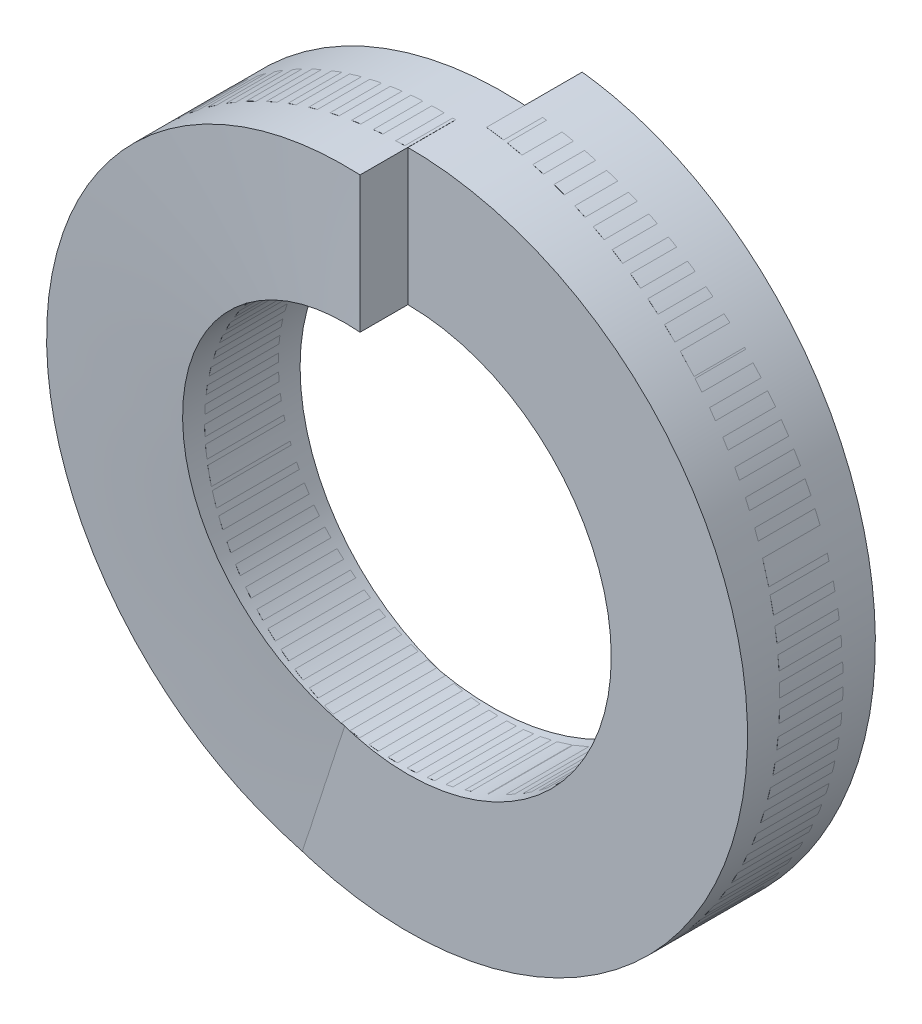
ISO-10303-21;
HEADER;
FILE_DESCRIPTION(('STEP AP214'),'2;1');
FILE_NAME('part.step','',(''),(''),'','','');
FILE_SCHEMA(('AUTOMOTIVE_DESIGN { 1 0 10303 214 1 1 1 1 }'));
ENDSEC;
DATA;
#1=APPLICATION_CONTEXT('core data for automotive mechanical design processes');
#2=APPLICATION_PROTOCOL_DEFINITION('international standard','automotive_design',2000,#1);
#3=PRODUCT_CONTEXT('',#1,'mechanical');
#4=PRODUCT('Part','Part','',(#3));
#5=PRODUCT_RELATED_PRODUCT_CATEGORY('part','',(#4));
#6=PRODUCT_DEFINITION_FORMATION('','',#4);
#7=PRODUCT_DEFINITION_CONTEXT('part definition',#1,'design');
#8=PRODUCT_DEFINITION('design','',#6,#7);
#9=PRODUCT_DEFINITION_SHAPE('','',#8);
#10=(LENGTH_UNIT() NAMED_UNIT(*) SI_UNIT(.MILLI.,.METRE.));
#11=(NAMED_UNIT(*) PLANE_ANGLE_UNIT() SI_UNIT($,.RADIAN.));
#12=(NAMED_UNIT(*) SI_UNIT($,.STERADIAN.) SOLID_ANGLE_UNIT());
#13=UNCERTAINTY_MEASURE_WITH_UNIT(LENGTH_MEASURE(1.E-05),#10,'distance_accuracy_value','');
#14=(GEOMETRIC_REPRESENTATION_CONTEXT(3) GLOBAL_UNCERTAINTY_ASSIGNED_CONTEXT((#13)) GLOBAL_UNIT_ASSIGNED_CONTEXT((#10,
#11,#12)) REPRESENTATION_CONTEXT('',''));
#15=CARTESIAN_POINT('',(0.,0.,0.));
#16=DIRECTION('',(0.,0.,1.));
#17=DIRECTION('',(1.,0.,0.));
#18=AXIS2_PLACEMENT_3D('',#15,#16,#17);
#19=CARTESIAN_POINT('',(0.,4.2418,1.1938));
#20=CARTESIAN_POINT('',(-1.75701108887419,4.2418,1.11089722222222));
#21=CARTESIAN_POINT('',(-2.9994055444371,2.9994055444371,1.02799444444444));
#22=CARTESIAN_POINT('',(-4.2418,1.75701108887419,0.945091666666666));
#23=CARTESIAN_POINT('',(-4.2418,0.,0.862188888888889));
#24=CARTESIAN_POINT('',(-4.2418,-1.75701108887419,0.779286111111111));
#25=CARTESIAN_POINT('',(-2.9994055444371,-2.9994055444371,0.696383333333333));
#26=CARTESIAN_POINT('',(-1.7570110888742,-4.2418,0.613480555555555));
#27=CARTESIAN_POINT('',(0.,-4.2418,0.530577777777778));
#28=CARTESIAN_POINT('',(1.75701108887419,-4.2418,0.447675));
#29=CARTESIAN_POINT('',(2.9994055444371,-2.9994055444371,0.364772222222222));
#30=CARTESIAN_POINT('',(4.2418,-1.7570110888742,0.281869444444444));
#31=CARTESIAN_POINT('',(4.2418,0.,0.198966666666666));
#32=CARTESIAN_POINT('',(4.2418,1.7570110888742,0.116063888888889));
#33=CARTESIAN_POINT('',(2.9994055444371,2.9994055444371,0.0331611111111108));
#34=CARTESIAN_POINT('',(1.86603502883287,4.13277606004133,-0.0424666925822432));
#35=CARTESIAN_POINT('',(0.266370499691194,4.23342816130075,-0.119912402591284));
#36=CARTESIAN_POINT('',(0.,2.54,1.1938));
#37=CARTESIAN_POINT('',(-1.05210244842766,2.54,1.11089722222222));
#38=CARTESIAN_POINT('',(-1.79605122421383,1.79605122421383,1.02799444444444));
#39=CARTESIAN_POINT('',(-2.54,1.05210244842766,0.945091666666667));
#40=CARTESIAN_POINT('',(-2.54,0.,0.862188888888889));
#41=CARTESIAN_POINT('',(-2.54,-1.05210244842766,0.779286111111111));
#42=CARTESIAN_POINT('',(-1.79605122421383,-1.79605122421383,0.696383333333333));
#43=CARTESIAN_POINT('',(-1.05210244842766,-2.54,0.613480555555556));
#44=CARTESIAN_POINT('',(0.,-2.54,0.530577777777778));
#45=CARTESIAN_POINT('',(1.05210244842766,-2.54,0.447675));
#46=CARTESIAN_POINT('',(1.79605122421383,-1.79605122421383,0.364772222222222));
#47=CARTESIAN_POINT('',(2.54,-1.05210244842766,0.281869444444445));
#48=CARTESIAN_POINT('',(2.54,0.,0.198966666666667));
#49=CARTESIAN_POINT('',(2.54,1.05210244842766,0.116063888888889));
#50=CARTESIAN_POINT('',(1.79605122421383,1.79605122421383,0.0331611111111111));
#51=CARTESIAN_POINT('',(1.1173862448101,2.47471620361756,-0.042466692582243));
#52=CARTESIAN_POINT('',(0.15950329322826,2.53498692293458,-0.119912402591283));
#53=(BOUNDED_SURFACE() B_SPLINE_SURFACE(1,2,((#19,#20,#21,#22,#23,#24,#25,#26,#27,#28,#29,#30,
#31,#32,#33,#34,#35),(#36,#37,#38,#39,#40,#41,#42,#43,#44,#45,#46,#47,#48,#49,#50,#51,#52)),
.UNSPECIFIED.,.F.,.F.,.F.) B_SPLINE_SURFACE_WITH_KNOTS((2,2),(3,2,2,2,2,2,2,2,3),(0.,1.),(0.,
0.125,0.25,0.375,0.5,0.625,0.75,0.875,0.989797691254952),
.UNSPECIFIED.) GEOMETRIC_REPRESENTATION_ITEM() RATIONAL_B_SPLINE_SURFACE(((1.,0.923879532511287,
1.,0.923879532511287,1.,0.923879532511287,1.,0.923879532511287,1.,0.923879532511287,1.,
0.923879532511287,1.,0.923879532511287,1.,0.930092368600385,0.988588492173218),(1.,
0.923879532511287,1.,0.923879532511287,1.,0.923879532511287,1.,0.923879532511287,1.,
0.923879532511287,1.,0.923879532511287,1.,0.923879532511287,1.,0.930092368600385,0.988588492173218))) REPRESENTATION_ITEM('') SURFACE());
#54=CARTESIAN_POINT('',(0.,4.2418,1.1938));
#55=CARTESIAN_POINT('',(-1.75701108887419,4.2418,1.11089722222222));
#56=CARTESIAN_POINT('',(-2.9994055444371,2.9994055444371,1.02799444444444));
#57=CARTESIAN_POINT('',(-4.2418,1.75701108887419,0.945091666666666));
#58=CARTESIAN_POINT('',(-4.2418,0.,0.862188888888889));
#59=CARTESIAN_POINT('',(-4.2418,-1.75701108887419,0.779286111111111));
#60=CARTESIAN_POINT('',(-2.9994055444371,-2.9994055444371,0.696383333333333));
#61=CARTESIAN_POINT('',(-1.7570110888742,-4.2418,0.613480555555555));
#62=CARTESIAN_POINT('',(0.,-4.2418,0.530577777777778));
#63=CARTESIAN_POINT('',(1.75701108887419,-4.2418,0.447675));
#64=CARTESIAN_POINT('',(2.9994055444371,-2.9994055444371,0.364772222222222));
#65=CARTESIAN_POINT('',(4.2418,-1.7570110888742,0.281869444444444));
#66=CARTESIAN_POINT('',(4.2418,0.,0.198966666666666));
#67=CARTESIAN_POINT('',(4.2418,1.7570110888742,0.116063888888889));
#68=CARTESIAN_POINT('',(2.9994055444371,2.9994055444371,0.0331611111111108));
#69=CARTESIAN_POINT('',(1.86603502883287,4.13277606004133,-0.0424666925822432));
#70=CARTESIAN_POINT('',(0.266370499691194,4.23342816130075,-0.119912402591284));
#71=(BOUNDED_CURVE() B_SPLINE_CURVE(2,(#54,#55,#56,#57,#58,#59,#60,#61,#62,#63,#64,#65,#66,#67,
#68,#69,#70),.UNSPECIFIED.,.F.,.F.) B_SPLINE_CURVE_WITH_KNOTS((3,2,2,2,2,2,2,2,3),(0.,0.125,
0.25,0.375,0.5,0.625,0.75,0.875,0.989797691254952),
.UNSPECIFIED.) CURVE() GEOMETRIC_REPRESENTATION_ITEM() RATIONAL_B_SPLINE_CURVE((1.,
0.923879532511287,1.,0.923879532511287,1.,0.923879532511287,1.,0.923879532511287,1.,
0.923879532511287,1.,0.923879532511287,1.,0.923879532511287,1.,0.930092368600385,0.988588492173218)) REPRESENTATION_ITEM(''));
#72=CARTESIAN_POINT('',(0.,4.2418,1.1938));
#73=VERTEX_POINT('',#72);
#74=CARTESIAN_POINT('',(0.266370499687325,4.23342816123927,-0.119912402577863));
#75=VERTEX_POINT('',#74);
#76=EDGE_CURVE('P0_E22',#73,#75,#71,.T.);
#77=DIRECTION('',(0.0627965721371101,0.99802634761204,0.));
#78=VECTOR('',#77,1.);
#79=CARTESIAN_POINT('',(0.186220094843992,2.95959723252612,-0.119912402564443));
#80=LINE('',#79,#78);
#81=CARTESIAN_POINT('',(0.159503293230576,2.5349869229714,-0.119912402577863));
#82=VERTEX_POINT('',#81);
#83=EDGE_CURVE('P0_E98',#75,#82,#80,.F.);
#84=CARTESIAN_POINT('',(0.,2.54,1.1938));
#85=CARTESIAN_POINT('',(-1.05210244842766,2.54,1.11089722222222));
#86=CARTESIAN_POINT('',(-1.79605122421383,1.79605122421383,1.02799444444444));
#87=CARTESIAN_POINT('',(-2.54,1.05210244842766,0.945091666666667));
#88=CARTESIAN_POINT('',(-2.54,0.,0.862188888888889));
#89=CARTESIAN_POINT('',(-2.54,-1.05210244842766,0.779286111111111));
#90=CARTESIAN_POINT('',(-1.79605122421383,-1.79605122421383,0.696383333333333));
#91=CARTESIAN_POINT('',(-1.05210244842766,-2.54,0.613480555555556));
#92=CARTESIAN_POINT('',(0.,-2.54,0.530577777777778));
#93=CARTESIAN_POINT('',(1.05210244842766,-2.54,0.447675));
#94=CARTESIAN_POINT('',(1.79605122421383,-1.79605122421383,0.364772222222222));
#95=CARTESIAN_POINT('',(2.54,-1.05210244842766,0.281869444444445));
#96=CARTESIAN_POINT('',(2.54,0.,0.198966666666667));
#97=CARTESIAN_POINT('',(2.54,1.05210244842766,0.116063888888889));
#98=CARTESIAN_POINT('',(1.79605122421383,1.79605122421383,0.0331611111111111));
#99=CARTESIAN_POINT('',(1.1173862448101,2.47471620361756,-0.042466692582243));
#100=CARTESIAN_POINT('',(0.15950329322826,2.53498692293458,-0.119912402591283));
#101=(BOUNDED_CURVE() B_SPLINE_CURVE(2,(#84,#85,#86,#87,#88,#89,#90,#91,#92,#93,#94,#95,#96,#97,
#98,#99,#100),.UNSPECIFIED.,.F.,.F.) B_SPLINE_CURVE_WITH_KNOTS((3,2,2,2,2,2,2,2,3),(0.,0.125,
0.25,0.375,0.5,0.625,0.75,0.875,0.989797691254952),
.UNSPECIFIED.) CURVE() GEOMETRIC_REPRESENTATION_ITEM() RATIONAL_B_SPLINE_CURVE((1.,
0.923879532511287,1.,0.923879532511287,1.,0.923879532511287,1.,0.923879532511287,1.,
0.923879532511287,1.,0.923879532511287,1.,0.923879532511287,1.,0.930092368600385,0.988588492173218)) REPRESENTATION_ITEM(''));
#102=CARTESIAN_POINT('',(0.,2.54,1.1938));
#103=VERTEX_POINT('',#102);
#104=EDGE_CURVE('P0_E62',#82,#103,#101,.F.);
#105=DIRECTION('',(0.,-1.,0.));
#106=VECTOR('',#105,1.);
#107=CARTESIAN_POINT('',(0.,3.3909,1.1938));
#108=LINE('',#107,#106);
#109=EDGE_CURVE('P0_E58',#73,#103,#108,.T.);
#110=ORIENTED_EDGE('',*,*,#76,.T.);
#111=ORIENTED_EDGE('',*,*,#83,.T.);
#112=ORIENTED_EDGE('',*,*,#104,.T.);
#113=ORIENTED_EDGE('',*,*,#109,.F.);
#114=EDGE_LOOP('',(#110,#111,#112,#113));
#115=FACE_BOUND('',#114,.T.);
#116=ADVANCED_FACE('P0_F17',(#115),#53,.F.);
#117=CARTESIAN_POINT('',(0.,4.2418,0.));
#118=CARTESIAN_POINT('',(-1.75701108887419,4.2418,-0.0829027777777778));
#119=CARTESIAN_POINT('',(-2.9994055444371,2.9994055444371,-0.165805555555556));
#120=CARTESIAN_POINT('',(-4.2418,1.75701108887419,-0.248708333333333));
#121=CARTESIAN_POINT('',(-4.2418,0.,-0.331611111111111));
#122=CARTESIAN_POINT('',(-4.2418,-1.75701108887419,-0.414513888888889));
#123=CARTESIAN_POINT('',(-2.9994055444371,-2.9994055444371,-0.497416666666667));
#124=CARTESIAN_POINT('',(-1.7570110888742,-4.2418,-0.580319444444445));
#125=CARTESIAN_POINT('',(0.,-4.2418,-0.663222222222222));
#126=CARTESIAN_POINT('',(1.75701108887419,-4.2418,-0.746125));
#127=CARTESIAN_POINT('',(2.9994055444371,-2.9994055444371,-0.829027777777778));
#128=CARTESIAN_POINT('',(4.2418,-1.7570110888742,-0.911930555555556));
#129=CARTESIAN_POINT('',(4.2418,0.,-0.994833333333333));
#130=CARTESIAN_POINT('',(4.2418,1.7570110888742,-1.07773611111111));
#131=CARTESIAN_POINT('',(2.9994055444371,2.9994055444371,-1.16063888888889));
#132=CARTESIAN_POINT('',(1.86603502905745,4.13277605981674,-1.23626669256726));
#133=CARTESIAN_POINT('',(0.266370500245948,4.23342816126585,-1.31371240256443));
#134=CARTESIAN_POINT('',(0.,4.2418,1.1938));
#135=CARTESIAN_POINT('',(-1.75701108887419,4.2418,1.11089722222222));
#136=CARTESIAN_POINT('',(-2.9994055444371,2.9994055444371,1.02799444444444));
#137=CARTESIAN_POINT('',(-4.2418,1.75701108887419,0.945091666666666));
#138=CARTESIAN_POINT('',(-4.2418,0.,0.862188888888889));
#139=CARTESIAN_POINT('',(-4.2418,-1.75701108887419,0.779286111111111));
#140=CARTESIAN_POINT('',(-2.9994055444371,-2.9994055444371,0.696383333333333));
#141=CARTESIAN_POINT('',(-1.7570110888742,-4.2418,0.613480555555555));
#142=CARTESIAN_POINT('',(0.,-4.2418,0.530577777777778));
#143=CARTESIAN_POINT('',(1.75701108887419,-4.2418,0.447675));
#144=CARTESIAN_POINT('',(2.9994055444371,-2.9994055444371,0.364772222222222));
#145=CARTESIAN_POINT('',(4.2418,-1.7570110888742,0.281869444444444));
#146=CARTESIAN_POINT('',(4.2418,0.,0.198966666666666));
#147=CARTESIAN_POINT('',(4.2418,1.7570110888742,0.116063888888889));
#148=CARTESIAN_POINT('',(2.9994055444371,2.9994055444371,0.0331611111111108));
#149=CARTESIAN_POINT('',(1.86603502905745,4.13277605981674,-0.0424666925672572));
#150=CARTESIAN_POINT('',(0.266370500245948,4.23342816126585,-0.119912402564426));
#151=(BOUNDED_SURFACE() B_SPLINE_SURFACE(1,2,((#117,#118,#119,#120,#121,#122,#123,#124,#125,
#126,#127,#128,#129,#130,#131,#132,#133),(#134,#135,#136,#137,#138,#139,#140,#141,#142,#143,
#144,#145,#146,#147,#148,#149,#150)),.UNSPECIFIED.,.F.,.F.,.F.) B_SPLINE_SURFACE_WITH_KNOTS((2,
2),(3,2,2,2,2,2,2,2,3),(0.,1.),(0.,0.125,0.25,0.375,0.5,0.625,0.75,0.875,0.989797691233794),
.UNSPECIFIED.) GEOMETRIC_REPRESENTATION_ITEM() RATIONAL_B_SPLINE_SURFACE(((1.,0.923879532511287,
1.,0.923879532511287,1.,0.923879532511287,1.,0.923879532511287,1.,0.923879532511287,1.,
0.923879532511287,1.,0.923879532511287,1.,0.930092368613269,0.988588492151656),(1.,
0.923879532511287,1.,0.923879532511287,1.,0.923879532511287,1.,0.923879532511287,1.,
0.923879532511287,1.,0.923879532511287,1.,0.923879532511287,1.,0.930092368613269,0.988588492151656))) REPRESENTATION_ITEM('') SURFACE());
#152=CARTESIAN_POINT('',(0.,4.2418,0.));
#153=CARTESIAN_POINT('',(-1.75701108887419,4.2418,-0.0829027777777778));
#154=CARTESIAN_POINT('',(-2.9994055444371,2.9994055444371,-0.165805555555556));
#155=CARTESIAN_POINT('',(-4.2418,1.75701108887419,-0.248708333333333));
#156=CARTESIAN_POINT('',(-4.2418,0.,-0.331611111111111));
#157=CARTESIAN_POINT('',(-4.2418,-1.75701108887419,-0.414513888888889));
#158=CARTESIAN_POINT('',(-2.9994055444371,-2.9994055444371,-0.497416666666667));
#159=CARTESIAN_POINT('',(-1.7570110888742,-4.2418,-0.580319444444445));
#160=CARTESIAN_POINT('',(0.,-4.2418,-0.663222222222222));
#161=CARTESIAN_POINT('',(1.75701108887419,-4.2418,-0.746125));
#162=CARTESIAN_POINT('',(2.9994055444371,-2.9994055444371,-0.829027777777778));
#163=CARTESIAN_POINT('',(4.2418,-1.7570110888742,-0.911930555555556));
#164=CARTESIAN_POINT('',(4.2418,0.,-0.994833333333333));
#165=CARTESIAN_POINT('',(4.2418,1.7570110888742,-1.07773611111111));
#166=CARTESIAN_POINT('',(2.9994055444371,2.9994055444371,-1.16063888888889));
#167=CARTESIAN_POINT('',(1.86603502905745,4.13277605981674,-1.23626669256726));
#168=CARTESIAN_POINT('',(0.266370500245948,4.23342816126585,-1.31371240256443));
#169=(BOUNDED_CURVE() B_SPLINE_CURVE(2,(#152,#153,#154,#155,#156,#157,#158,#159,#160,#161,#162,
#163,#164,#165,#166,#167,#168),.UNSPECIFIED.,.F.,.F.) B_SPLINE_CURVE_WITH_KNOTS((3,2,2,2,2,2,2,
2,3),(0.,0.125,0.25,0.375,0.5,0.625,0.75,0.875,0.989797691233794),
.UNSPECIFIED.) CURVE() GEOMETRIC_REPRESENTATION_ITEM() RATIONAL_B_SPLINE_CURVE((1.,
0.923879532511287,1.,0.923879532511287,1.,0.923879532511287,1.,0.923879532511287,1.,
0.923879532511287,1.,0.923879532511287,1.,0.923879532511287,1.,0.930092368613269,0.988588492151656)) REPRESENTATION_ITEM(''));
#170=CARTESIAN_POINT('',(0.,4.2418,0.));
#171=VERTEX_POINT('',#170);
#172=CARTESIAN_POINT('',(0.266406934716354,4.23342591409121,-1.31371041587303));
#173=VERTEX_POINT('',#172);
#174=EDGE_CURVE('P0_E73',#171,#173,#169,.T.);
#175=DIRECTION('',(-3.05178807928708E-05,1.92020812603457E-06,0.999999999532486));
#176=VECTOR('',#175,1.);
#177=CARTESIAN_POINT('',(0.266370499683457,4.23342816117779,-0.119912402591283));
#178=LINE('',#177,#176);
#179=EDGE_CURVE('P0_E71',#173,#75,#178,.T.);
#180=DIRECTION('',(0.,0.,-1.));
#181=VECTOR('',#180,1.);
#182=CARTESIAN_POINT('',(0.,4.2418,1.1938));
#183=LINE('',#182,#181);
#184=EDGE_CURVE('P0_E70',#171,#73,#183,.F.);
#185=ORIENTED_EDGE('',*,*,#174,.T.);
#186=ORIENTED_EDGE('',*,*,#179,.T.);
#187=ORIENTED_EDGE('',*,*,#76,.F.);
#188=ORIENTED_EDGE('',*,*,#184,.F.);
#189=EDGE_LOOP('',(#185,#186,#187,#188));
#190=FACE_BOUND('',#189,.T.);
#191=ADVANCED_FACE('P0_F69',(#190),#151,.F.);
#192=CARTESIAN_POINT('',(0.186220094843993,2.95959723252612,-0.119912402591283));
#193=DIRECTION('',(0.998026347145449,-0.0627965721077518,3.05782315926733E-05));
#194=DIRECTION('',(0.0627965721371101,0.99802634761204,0.));
#195=AXIS2_PLACEMENT_3D('',#192,#193,#194);
#196=PLANE('',#195);
#197=ORIENTED_EDGE('',*,*,#179,.F.);
#198=DIRECTION('',(0.0627965721371101,0.99802634761204,0.));
#199=VECTOR('',#198,1.);
#200=CARTESIAN_POINT('',(0.186256527022673,2.95959494018591,-1.31371019312836));
#201=LINE('',#200,#199);
#202=CARTESIAN_POINT('',(0.159536082166422,2.53498485971893,-1.31370989888731));
#203=VERTEX_POINT('',#202);
#204=EDGE_CURVE('P0_E75',#173,#203,#201,.F.);
#205=ORIENTED_EDGE('',*,*,#204,.T.);
#206=DIRECTION('',(-3.05178807928708E-05,1.92020812603457E-06,0.999999999532486));
#207=VECTOR('',#206,1.);
#208=CARTESIAN_POINT('',(0.159503293223627,2.53498692286095,-0.119912402591283));
#209=LINE('',#208,#207);
#210=EDGE_CURVE('P0_E92',#203,#82,#209,.T.);
#211=ORIENTED_EDGE('',*,*,#210,.T.);
#212=ORIENTED_EDGE('',*,*,#83,.F.);
#213=EDGE_LOOP('',(#197,#205,#211,#212));
#214=FACE_BOUND('',#213,.T.);
#215=ADVANCED_FACE('P0_F104',(#214),#196,.F.);
#216=CARTESIAN_POINT('',(0.,2.54,1.1938));
#217=CARTESIAN_POINT('',(-1.05210244842766,2.54,1.11089722222222));
#218=CARTESIAN_POINT('',(-1.79605122421383,1.79605122421383,1.02799444444444));
#219=CARTESIAN_POINT('',(-2.54,1.05210244842766,0.945091666666667));
#220=CARTESIAN_POINT('',(-2.54,0.,0.862188888888889));
#221=CARTESIAN_POINT('',(-2.54,-1.05210244842766,0.779286111111111));
#222=CARTESIAN_POINT('',(-1.79605122421383,-1.79605122421383,0.696383333333333));
#223=CARTESIAN_POINT('',(-1.05210244842766,-2.54,0.613480555555556));
#224=CARTESIAN_POINT('',(0.,-2.54,0.530577777777778));
#225=CARTESIAN_POINT('',(1.05210244842766,-2.54,0.447675));
#226=CARTESIAN_POINT('',(1.79605122421383,-1.79605122421383,0.364772222222222));
#227=CARTESIAN_POINT('',(2.54,-1.05210244842766,0.281869444444445));
#228=CARTESIAN_POINT('',(2.54,0.,0.198966666666667));
#229=CARTESIAN_POINT('',(2.54,1.05210244842766,0.116063888888889));
#230=CARTESIAN_POINT('',(1.79605122421383,1.79605122421383,0.0331611111111111));
#231=CARTESIAN_POINT('',(1.11739730650417,2.4747051419235,-0.0424654599097867));
#232=CARTESIAN_POINT('',(0.159530617336155,2.53498520353322,-0.119910193407421));
#233=CARTESIAN_POINT('',(0.0818279409911224,2.53987515551744,-0.12619255308194));
#234=CARTESIAN_POINT('',(0.00412526464608996,2.54476510750166,-0.132474912756459));
#235=CARTESIAN_POINT('',(0.,2.54,0.));
#236=CARTESIAN_POINT('',(-1.05210244842766,2.54,-0.0829027777777778));
#237=CARTESIAN_POINT('',(-1.79605122421383,1.79605122421383,-0.165805555555556));
#238=CARTESIAN_POINT('',(-2.54,1.05210244842766,-0.248708333333333));
#239=CARTESIAN_POINT('',(-2.54,0.,-0.331611111111111));
#240=CARTESIAN_POINT('',(-2.54,-1.05210244842766,-0.414513888888889));
#241=CARTESIAN_POINT('',(-1.79605122421383,-1.79605122421383,-0.497416666666667));
#242=CARTESIAN_POINT('',(-1.05210244842766,-2.54,-0.580319444444445));
#243=CARTESIAN_POINT('',(0.,-2.54,-0.663222222222222));
#244=CARTESIAN_POINT('',(1.05210244842766,-2.54,-0.746125));
#245=CARTESIAN_POINT('',(1.79605122421383,-1.79605122421383,-0.829027777777778));
#246=CARTESIAN_POINT('',(2.54,-1.05210244842766,-0.911930555555556));
#247=CARTESIAN_POINT('',(2.54,0.,-0.994833333333333));
#248=CARTESIAN_POINT('',(2.54,1.05210244842766,-1.07773611111111));
#249=CARTESIAN_POINT('',(1.79605122421383,1.79605122421383,-1.16063888888889));
#250=CARTESIAN_POINT('',(1.11739730650417,2.4747051419235,-1.23626545990979));
#251=CARTESIAN_POINT('',(0.159530617336155,2.53498520353322,-1.31371019340742));
#252=CARTESIAN_POINT('',(0.0818279409911224,2.53987515551744,-1.31999255308194));
#253=CARTESIAN_POINT('',(0.0041252646460899,2.54476510750166,-1.32627491275646));
#254=(BOUNDED_SURFACE() B_SPLINE_SURFACE(1,2,((#216,#217,#218,#219,#220,#221,#222,#223,#224,
#225,#226,#227,#228,#229,#230,#231,#232,#233,#234),(#235,#236,#237,#238,#239,#240,#241,#242,
#243,#244,#245,#246,#247,#248,#249,#250,#251,#252,#253)),.UNSPECIFIED.,.F.,.F.,
.F.) B_SPLINE_SURFACE_WITH_KNOTS((2,2),(3,2,2,2,2,2,2,2,2,3),(0.,1.),(0.,0.125,0.25,0.375,0.5,
0.625,0.75,0.875,0.989795950947686,0.999693910457163),
.UNSPECIFIED.) GEOMETRIC_REPRESENTATION_ITEM() RATIONAL_B_SPLINE_SURFACE(((1.,0.923879532511287,
1.,0.923879532511287,1.,0.923879532511287,1.,0.923879532511287,1.,0.923879532511287,1.,
0.923879532511287,1.,0.923879532511287,1.,0.930093428384406,0.988586718626486,0.988586718626486,
0.988586718626486),(1.,0.923879532511287,1.,0.923879532511287,1.,0.923879532511287,1.,
0.923879532511287,1.,0.923879532511287,1.,0.923879532511287,1.,0.923879532511287,1.,
0.930093428384406,0.988586718626486,0.988586718626486,0.988586718626486))) REPRESENTATION_ITEM('') SURFACE());
#255=CARTESIAN_POINT('',(0.,2.54,0.));
#256=CARTESIAN_POINT('',(-1.05210244842766,2.54,-0.0829027777777778));
#257=CARTESIAN_POINT('',(-1.79605122421383,1.79605122421383,-0.165805555555556));
#258=CARTESIAN_POINT('',(-2.54,1.05210244842766,-0.248708333333333));
#259=CARTESIAN_POINT('',(-2.54,0.,-0.331611111111111));
#260=CARTESIAN_POINT('',(-2.54,-1.05210244842766,-0.414513888888889));
#261=CARTESIAN_POINT('',(-1.79605122421383,-1.79605122421383,-0.497416666666667));
#262=CARTESIAN_POINT('',(-1.05210244842766,-2.54,-0.580319444444445));
#263=CARTESIAN_POINT('',(0.,-2.54,-0.663222222222222));
#264=CARTESIAN_POINT('',(1.05210244842766,-2.54,-0.746125));
#265=CARTESIAN_POINT('',(1.79605122421383,-1.79605122421383,-0.829027777777778));
#266=CARTESIAN_POINT('',(2.54,-1.05210244842766,-0.911930555555556));
#267=CARTESIAN_POINT('',(2.54,0.,-0.994833333333333));
#268=CARTESIAN_POINT('',(2.54,1.05210244842766,-1.07773611111111));
#269=CARTESIAN_POINT('',(1.79605122421383,1.79605122421383,-1.16063888888889));
#270=CARTESIAN_POINT('',(1.11739730650419,2.47470514192347,-1.23626545990978));
#271=CARTESIAN_POINT('',(0.159530617336211,2.53498520353321,-1.31371019340742));
#272=CARTESIAN_POINT('',(0.0818279409911783,2.53987515551744,-1.31999255308194));
#273=CARTESIAN_POINT('',(0.00412526464614593,2.54476510750166,-1.32627491275645));
#274=(BOUNDED_CURVE() B_SPLINE_CURVE(2,(#255,#256,#257,#258,#259,#260,#261,#262,#263,#264,#265,
#266,#267,#268,#269,#270,#271,#272,#273),.UNSPECIFIED.,.F.,.F.) B_SPLINE_CURVE_WITH_KNOTS((3,2,
2,2,2,2,2,2,2,3),(0.,0.125,0.25,0.375,0.5,0.625,0.75,0.875,0.989795950947682,0.999693910457159),
.UNSPECIFIED.) CURVE() GEOMETRIC_REPRESENTATION_ITEM() RATIONAL_B_SPLINE_CURVE((1.,
0.923879532511287,1.,0.923879532511287,1.,0.923879532511287,1.,0.923879532511287,1.,
0.923879532511287,1.,0.923879532511287,1.,0.923879532511287,1.,0.930093428384408,
0.988586718626483,0.988586718626483,0.988586718626483)) REPRESENTATION_ITEM(''));
#275=CARTESIAN_POINT('',(0.,2.54,0.));
#276=VERTEX_POINT('',#275);
#277=EDGE_CURVE('P0_E30',#203,#276,#274,.F.);
#278=DIRECTION('',(0.,0.,-1.));
#279=VECTOR('',#278,1.);
#280=CARTESIAN_POINT('',(0.,2.54,1.1938));
#281=LINE('',#280,#279);
#282=EDGE_CURVE('P0_E38',#103,#276,#281,.T.);
#283=ORIENTED_EDGE('',*,*,#104,.F.);
#284=ORIENTED_EDGE('',*,*,#210,.F.);
#285=ORIENTED_EDGE('',*,*,#277,.T.);
#286=ORIENTED_EDGE('',*,*,#282,.F.);
#287=EDGE_LOOP('',(#283,#284,#285,#286));
#288=FACE_BOUND('',#287,.T.);
#289=ADVANCED_FACE('P0_F101',(#288),#254,.F.);
#290=CARTESIAN_POINT('',(0.,3.3909,1.1938));
#291=DIRECTION('',(1.,0.,0.));
#292=DIRECTION('',(0.,0.,-1.));
#293=AXIS2_PLACEMENT_3D('',#290,#291,#292);
#294=PLANE('',#293);
#295=DIRECTION('',(0.,1.,0.));
#296=VECTOR('',#295,1.);
#297=CARTESIAN_POINT('',(0.,3.3909,0.));
#298=LINE('',#297,#296);
#299=EDGE_CURVE('P0_E11',#276,#171,#298,.T.);
#300=ORIENTED_EDGE('',*,*,#299,.T.);
#301=ORIENTED_EDGE('',*,*,#184,.T.);
#302=ORIENTED_EDGE('',*,*,#109,.T.);
#303=ORIENTED_EDGE('',*,*,#282,.T.);
#304=EDGE_LOOP('',(#300,#301,#302,#303));
#305=FACE_BOUND('',#304,.T.);
#306=ADVANCED_FACE('P0_F72',(#305),#294,.T.);
#307=CARTESIAN_POINT('',(0.,2.54,0.));
#308=CARTESIAN_POINT('',(-1.05210244842766,2.54,-0.0829027777777778));
#309=CARTESIAN_POINT('',(-1.79605122421383,1.79605122421383,-0.165805555555556));
#310=CARTESIAN_POINT('',(-2.54,1.05210244842766,-0.248708333333333));
#311=CARTESIAN_POINT('',(-2.54,0.,-0.331611111111111));
#312=CARTESIAN_POINT('',(-2.54,-1.05210244842766,-0.414513888888889));
#313=CARTESIAN_POINT('',(-1.79605122421383,-1.79605122421383,-0.497416666666667));
#314=CARTESIAN_POINT('',(-1.05210244842766,-2.54,-0.580319444444445));
#315=CARTESIAN_POINT('',(0.,-2.54,-0.663222222222222));
#316=CARTESIAN_POINT('',(1.05210244842766,-2.54,-0.746125));
#317=CARTESIAN_POINT('',(1.79605122421383,-1.79605122421383,-0.829027777777778));
#318=CARTESIAN_POINT('',(2.54,-1.05210244842766,-0.911930555555556));
#319=CARTESIAN_POINT('',(2.54,0.,-0.994833333333333));
#320=CARTESIAN_POINT('',(2.54,1.05210244842766,-1.07773611111111));
#321=CARTESIAN_POINT('',(1.79605122421383,1.79605122421383,-1.16063888888889));
#322=CARTESIAN_POINT('',(1.11739730650419,2.47470514192347,-1.23626545990978));
#323=CARTESIAN_POINT('',(0.159530617336211,2.53498520353321,-1.31371019340742));
#324=CARTESIAN_POINT('',(0.0818279409911783,2.53987515551744,-1.31999255308194));
#325=CARTESIAN_POINT('',(0.00412526464614593,2.54476510750166,-1.32627491275645));
#326=CARTESIAN_POINT('',(0.,4.2418,0.));
#327=CARTESIAN_POINT('',(-1.75701108887419,4.2418,-0.0829027777777778));
#328=CARTESIAN_POINT('',(-2.9994055444371,2.9994055444371,-0.165805555555556));
#329=CARTESIAN_POINT('',(-4.2418,1.75701108887419,-0.248708333333333));
#330=CARTESIAN_POINT('',(-4.2418,0.,-0.331611111111111));
#331=CARTESIAN_POINT('',(-4.2418,-1.75701108887419,-0.414513888888889));
#332=CARTESIAN_POINT('',(-2.9994055444371,-2.9994055444371,-0.497416666666667));
#333=CARTESIAN_POINT('',(-1.7570110888742,-4.2418,-0.580319444444445));
#334=CARTESIAN_POINT('',(0.,-4.2418,-0.663222222222222));
#335=CARTESIAN_POINT('',(1.75701108887419,-4.2418,-0.746125));
#336=CARTESIAN_POINT('',(2.9994055444371,-2.9994055444371,-0.829027777777778));
#337=CARTESIAN_POINT('',(4.2418,-1.7570110888742,-0.911930555555556));
#338=CARTESIAN_POINT('',(4.2418,0.,-0.994833333333333));
#339=CARTESIAN_POINT('',(4.2418,1.7570110888742,-1.07773611111111));
#340=CARTESIAN_POINT('',(2.9994055444371,2.9994055444371,-1.16063888888889));
#341=CARTESIAN_POINT('',(1.866053501862,4.1327575870122,-1.23626545990978));
#342=CARTESIAN_POINT('',(0.266416130951472,4.23342528990047,-1.31371019340742));
#343=CARTESIAN_POINT('',(0.136652661455268,4.24159150971412,-1.31999255308194));
#344=CARTESIAN_POINT('',(0.00688919195906372,4.24975772952778,-1.32627491275645));
#345=(BOUNDED_SURFACE() B_SPLINE_SURFACE(1,2,((#307,#308,#309,#310,#311,#312,#313,#314,#315,
#316,#317,#318,#319,#320,#321,#322,#323,#324,#325),(#326,#327,#328,#329,#330,#331,#332,#333,
#334,#335,#336,#337,#338,#339,#340,#341,#342,#343,#344)),.UNSPECIFIED.,.F.,.F.,
.F.) B_SPLINE_SURFACE_WITH_KNOTS((2,2),(3,2,2,2,2,2,2,2,2,3),(0.,1.),(0.,0.125,0.25,0.375,0.5,
0.625,0.75,0.875,0.989795950947682,0.999693910457159),
.UNSPECIFIED.) GEOMETRIC_REPRESENTATION_ITEM() RATIONAL_B_SPLINE_SURFACE(((1.,0.923879532511287,
1.,0.923879532511287,1.,0.923879532511287,1.,0.923879532511287,1.,0.923879532511287,1.,
0.923879532511287,1.,0.923879532511287,1.,0.930093428384408,0.988586718626483,0.988586718626483,
0.988586718626483),(1.,0.923879532511287,1.,0.923879532511287,1.,0.923879532511287,1.,
0.923879532511287,1.,0.923879532511287,1.,0.923879532511287,1.,0.923879532511287,1.,
0.930093428384408,0.988586718626483,0.988586718626483,0.988586718626483))) REPRESENTATION_ITEM('') SURFACE());
#346=ORIENTED_EDGE('',*,*,#277,.F.);
#347=ORIENTED_EDGE('',*,*,#204,.F.);
#348=ORIENTED_EDGE('',*,*,#174,.F.);
#349=ORIENTED_EDGE('',*,*,#299,.F.);
#350=EDGE_LOOP('',(#346,#347,#348,#349));
#351=FACE_BOUND('',#350,.T.);
#352=ADVANCED_FACE('P0_F107',(#351),#345,.F.);
#353=CLOSED_SHELL('',(#116,#191,#215,#289,#306,#352));
#354=MANIFOLD_SOLID_BREP('P0_B1',#353);
#355=CARTESIAN_POINT('',(0.,0.,-0.5969));
#356=DIRECTION('',(0.,0.,1.));
#357=DIRECTION('',(1.,0.,0.));
#358=AXIS2_PLACEMENT_3D('',#355,#356,#357);
#359=PLANE('',#358);
#360=CARTESIAN_POINT('',(0.,0.,-0.5969));
#361=DIRECTION('',(0.,0.,-1.));
#362=DIRECTION('',(-1.,0.,0.));
#363=AXIS2_PLACEMENT_3D('',#360,#361,#362);
#364=CIRCLE('',#363,2.53999999988009);
#365=CARTESIAN_POINT('',(-2.53999999988009,0.,-0.5969));
#366=VERTEX_POINT('',#365);
#367=EDGE_CURVE('P1_E27',#366,#366,#364,.F.);
#368=ORIENTED_EDGE('',*,*,#367,.T.);
#369=EDGE_LOOP('',(#368));
#370=FACE_BOUND('',#369,.T.);
#371=CARTESIAN_POINT('',(0.,0.,-0.5969));
#372=DIRECTION('',(0.,0.,-1.));
#373=DIRECTION('',(-1.,0.,0.));
#374=AXIS2_PLACEMENT_3D('',#371,#372,#373);
#375=CIRCLE('',#374,4.2418);
#376=CARTESIAN_POINT('',(-4.2418,0.,-0.5969));
#377=VERTEX_POINT('',#376);
#378=EDGE_CURVE('P1_E18',#377,#377,#375,.F.);
#379=ORIENTED_EDGE('',*,*,#378,.F.);
#380=EDGE_LOOP('',(#379));
#381=FACE_BOUND('',#380,.T.);
#382=ADVANCED_FACE('P1_F15',(#370,#381),#359,.F.);
#383=CARTESIAN_POINT('',(0.,0.,0.5969));
#384=DIRECTION('',(0.,0.,-1.));
#385=DIRECTION('',(-1.,0.,0.));
#386=AXIS2_PLACEMENT_3D('',#383,#384,#385);
#387=CYLINDRICAL_SURFACE('',#386,4.2418);
#388=ORIENTED_EDGE('',*,*,#378,.T.);
#389=EDGE_LOOP('',(#388));
#390=FACE_BOUND('',#389,.T.);
#391=CARTESIAN_POINT('',(0.,0.,0.5969));
#392=DIRECTION('',(0.,0.,-1.));
#393=DIRECTION('',(-1.,0.,0.));
#394=AXIS2_PLACEMENT_3D('',#391,#392,#393);
#395=CIRCLE('',#394,4.2418);
#396=CARTESIAN_POINT('',(-4.2418,0.,0.5969));
#397=VERTEX_POINT('',#396);
#398=EDGE_CURVE('P1_E22',#397,#397,#395,.F.);
#399=ORIENTED_EDGE('',*,*,#398,.F.);
#400=EDGE_LOOP('',(#399));
#401=FACE_BOUND('',#400,.T.);
#402=ADVANCED_FACE('P1_F35',(#390,#401),#387,.T.);
#403=CARTESIAN_POINT('',(0.,0.,0.5969));
#404=DIRECTION('',(0.,0.,-1.));
#405=DIRECTION('',(-1.,0.,0.));
#406=AXIS2_PLACEMENT_3D('',#403,#404,#405);
#407=CYLINDRICAL_SURFACE('',#406,2.53999999988009);
#408=CARTESIAN_POINT('',(0.,0.,0.5969));
#409=DIRECTION('',(0.,0.,-1.));
#410=DIRECTION('',(-1.,0.,0.));
#411=AXIS2_PLACEMENT_3D('',#408,#409,#410);
#412=CIRCLE('',#411,2.53999999988009);
#413=CARTESIAN_POINT('',(-2.53999999988009,0.,0.5969));
#414=VERTEX_POINT('',#413);
#415=EDGE_CURVE('P1_E10',#414,#414,#412,.T.);
#416=ORIENTED_EDGE('',*,*,#415,.F.);
#417=EDGE_LOOP('',(#416));
#418=FACE_BOUND('',#417,.T.);
#419=ORIENTED_EDGE('',*,*,#367,.F.);
#420=EDGE_LOOP('',(#419));
#421=FACE_BOUND('',#420,.T.);
#422=ADVANCED_FACE('P1_F43',(#418,#421),#407,.F.);
#423=CARTESIAN_POINT('',(0.,0.,0.5969));
#424=DIRECTION('',(0.,0.,1.));
#425=DIRECTION('',(1.,0.,0.));
#426=AXIS2_PLACEMENT_3D('',#423,#424,#425);
#427=PLANE('',#426);
#428=ORIENTED_EDGE('',*,*,#415,.T.);
#429=EDGE_LOOP('',(#428));
#430=FACE_BOUND('',#429,.T.);
#431=ORIENTED_EDGE('',*,*,#398,.T.);
#432=EDGE_LOOP('',(#431));
#433=FACE_BOUND('',#432,.T.);
#434=ADVANCED_FACE('P1_F44',(#430,#433),#427,.T.);
#435=CLOSED_SHELL('',(#382,#402,#422,#434));
#436=MANIFOLD_SOLID_BREP('P1_B1',#435);
#437=ADVANCED_BREP_SHAPE_REPRESENTATION('',(#18,#354,#436),#14);
#438=SHAPE_DEFINITION_REPRESENTATION(#9,#437);
ENDSEC;
END-ISO-10303-21;
